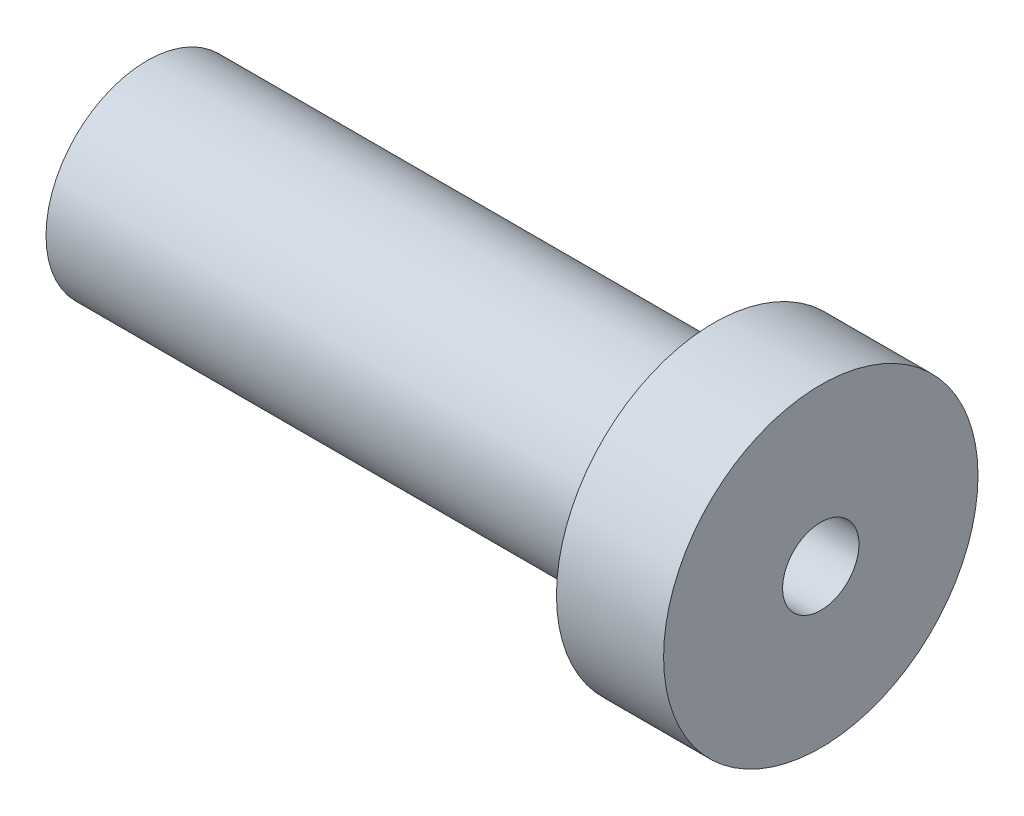
ISO-10303-21;
HEADER;
FILE_DESCRIPTION(('STEP AP214'),'2;1');
FILE_NAME('part.step','',(''),(''),'','','');
FILE_SCHEMA(('AUTOMOTIVE_DESIGN { 1 0 10303 214 1 1 1 1 }'));
ENDSEC;
DATA;
#1=APPLICATION_CONTEXT('core data for automotive mechanical design processes');
#2=APPLICATION_PROTOCOL_DEFINITION('international standard','automotive_design',2000,#1);
#3=PRODUCT_CONTEXT('',#1,'mechanical');
#4=PRODUCT('Part','Part','',(#3));
#5=PRODUCT_RELATED_PRODUCT_CATEGORY('part','',(#4));
#6=PRODUCT_DEFINITION_FORMATION('','',#4);
#7=PRODUCT_DEFINITION_CONTEXT('part definition',#1,'design');
#8=PRODUCT_DEFINITION('design','',#6,#7);
#9=PRODUCT_DEFINITION_SHAPE('','',#8);
#10=(LENGTH_UNIT() NAMED_UNIT(*) SI_UNIT(.MILLI.,.METRE.));
#11=(NAMED_UNIT(*) PLANE_ANGLE_UNIT() SI_UNIT($,.RADIAN.));
#12=(NAMED_UNIT(*) SI_UNIT($,.STERADIAN.) SOLID_ANGLE_UNIT());
#13=UNCERTAINTY_MEASURE_WITH_UNIT(LENGTH_MEASURE(1.E-05),#10,'distance_accuracy_value','');
#14=(GEOMETRIC_REPRESENTATION_CONTEXT(3) GLOBAL_UNCERTAINTY_ASSIGNED_CONTEXT((#13)) GLOBAL_UNIT_ASSIGNED_CONTEXT((#10,
#11,#12)) REPRESENTATION_CONTEXT('',''));
#15=CARTESIAN_POINT('',(0.,0.,0.));
#16=DIRECTION('',(0.,0.,1.));
#17=DIRECTION('',(1.,0.,0.));
#18=AXIS2_PLACEMENT_3D('',#15,#16,#17);
#19=CARTESIAN_POINT('',(0.,0.,0.));
#20=DIRECTION('',(1.,0.,0.));
#21=DIRECTION('',(0.,0.,-1.));
#22=AXIS2_PLACEMENT_3D('',#19,#20,#21);
#23=PLANE('',#22);
#24=CARTESIAN_POINT('',(0.,0.,0.));
#25=DIRECTION('',(1.,0.,0.));
#26=DIRECTION('',(0.,0.,-1.));
#27=AXIS2_PLACEMENT_3D('',#24,#25,#26);
#28=CIRCLE('',#27,1.7);
#29=CARTESIAN_POINT('',(0.,0.,-1.7));
#30=VERTEX_POINT('',#29);
#31=EDGE_CURVE('E61',#30,#30,#28,.T.);
#32=ORIENTED_EDGE('',*,*,#31,.T.);
#33=EDGE_LOOP('',(#32));
#34=FACE_BOUND('',#33,.T.);
#35=CARTESIAN_POINT('',(0.,0.,0.));
#36=DIRECTION('',(-1.,0.,0.));
#37=DIRECTION('',(0.,0.,1.));
#38=AXIS2_PLACEMENT_3D('',#35,#36,#37);
#39=CIRCLE('',#38,4.5);
#40=CARTESIAN_POINT('',(0.,0.,4.5));
#41=VERTEX_POINT('',#40);
#42=EDGE_CURVE('E10',#41,#41,#39,.T.);
#43=ORIENTED_EDGE('',*,*,#42,.T.);
#44=EDGE_LOOP('',(#43));
#45=FACE_BOUND('',#44,.T.);
#46=ADVANCED_FACE('F37',(#34,#45),#23,.F.);
#47=CARTESIAN_POINT('',(-5.95522388059701,0.,0.));
#48=DIRECTION('',(-1.,0.,0.));
#49=DIRECTION('',(0.,0.,1.));
#50=AXIS2_PLACEMENT_3D('',#47,#48,#49);
#51=CYLINDRICAL_SURFACE('',#50,4.5);
#52=ORIENTED_EDGE('',*,*,#42,.F.);
#53=EDGE_LOOP('',(#52));
#54=FACE_BOUND('',#53,.T.);
#55=CARTESIAN_POINT('',(25.2298662996806,0.,0.));
#56=DIRECTION('',(-1.,0.,0.));
#57=DIRECTION('',(0.,0.,1.));
#58=AXIS2_PLACEMENT_3D('',#55,#56,#57);
#59=CIRCLE('',#58,4.5);
#60=CARTESIAN_POINT('',(25.2298662996806,0.,4.5));
#61=VERTEX_POINT('',#60);
#62=EDGE_CURVE('E44',#61,#61,#59,.T.);
#63=ORIENTED_EDGE('',*,*,#62,.T.);
#64=EDGE_LOOP('',(#63));
#65=FACE_BOUND('',#64,.T.);
#66=ADVANCED_FACE('F86',(#54,#65),#51,.T.);
#67=CARTESIAN_POINT('',(25.2298662996806,4.5,0.));
#68=DIRECTION('',(1.,0.,0.));
#69=DIRECTION('',(0.,0.,-1.));
#70=AXIS2_PLACEMENT_3D('',#67,#68,#69);
#71=PLANE('',#70);
#72=ORIENTED_EDGE('',*,*,#62,.F.);
#73=EDGE_LOOP('',(#72));
#74=FACE_BOUND('',#73,.T.);
#75=CARTESIAN_POINT('',(25.2298662996806,0.,0.));
#76=DIRECTION('',(-1.,0.,0.));
#77=DIRECTION('',(0.,0.,1.));
#78=AXIS2_PLACEMENT_3D('',#75,#76,#77);
#79=CIRCLE('',#78,7.);
#80=CARTESIAN_POINT('',(25.2298662996806,0.,7.));
#81=VERTEX_POINT('',#80);
#82=EDGE_CURVE('E49',#81,#81,#79,.T.);
#83=ORIENTED_EDGE('',*,*,#82,.T.);
#84=EDGE_LOOP('',(#83));
#85=FACE_BOUND('',#84,.T.);
#86=ADVANCED_FACE('F80',(#74,#85),#71,.F.);
#87=CARTESIAN_POINT('',(-5.95522388059701,0.,0.));
#88=DIRECTION('',(-1.,0.,0.));
#89=DIRECTION('',(0.,0.,1.));
#90=AXIS2_PLACEMENT_3D('',#87,#88,#89);
#91=CYLINDRICAL_SURFACE('',#90,7.);
#92=ORIENTED_EDGE('',*,*,#82,.F.);
#93=EDGE_LOOP('',(#92));
#94=FACE_BOUND('',#93,.T.);
#95=CARTESIAN_POINT('',(30.,0.,0.));
#96=DIRECTION('',(-1.,0.,0.));
#97=DIRECTION('',(0.,0.,1.));
#98=AXIS2_PLACEMENT_3D('',#95,#96,#97);
#99=CIRCLE('',#98,7.);
#100=CARTESIAN_POINT('',(30.,0.,7.));
#101=VERTEX_POINT('',#100);
#102=EDGE_CURVE('E54',#101,#101,#99,.T.);
#103=ORIENTED_EDGE('',*,*,#102,.T.);
#104=EDGE_LOOP('',(#103));
#105=FACE_BOUND('',#104,.T.);
#106=ADVANCED_FACE('F75',(#94,#105),#91,.T.);
#107=CARTESIAN_POINT('',(30.,7.,0.));
#108=DIRECTION('',(-1.,0.,0.));
#109=DIRECTION('',(0.,0.,1.));
#110=AXIS2_PLACEMENT_3D('',#107,#108,#109);
#111=PLANE('',#110);
#112=CARTESIAN_POINT('',(30.,0.,0.));
#113=DIRECTION('',(1.,0.,0.));
#114=DIRECTION('',(0.,0.,-1.));
#115=AXIS2_PLACEMENT_3D('',#112,#113,#114);
#116=CIRCLE('',#115,1.7);
#117=CARTESIAN_POINT('',(30.,0.,-1.7));
#118=VERTEX_POINT('',#117);
#119=EDGE_CURVE('E60',#118,#118,#116,.T.);
#120=ORIENTED_EDGE('',*,*,#119,.F.);
#121=EDGE_LOOP('',(#120));
#122=FACE_BOUND('',#121,.T.);
#123=ORIENTED_EDGE('',*,*,#102,.F.);
#124=EDGE_LOOP('',(#123));
#125=FACE_BOUND('',#124,.T.);
#126=ADVANCED_FACE('F72',(#122,#125),#111,.F.);
#127=CARTESIAN_POINT('',(30.,0.,0.));
#128=DIRECTION('',(-1.,0.,0.));
#129=DIRECTION('',(0.,0.,1.));
#130=AXIS2_PLACEMENT_3D('',#127,#128,#129);
#131=CYLINDRICAL_SURFACE('',#130,1.7);
#132=ORIENTED_EDGE('',*,*,#119,.T.);
#133=EDGE_LOOP('',(#132));
#134=FACE_BOUND('',#133,.T.);
#135=ORIENTED_EDGE('',*,*,#31,.F.);
#136=EDGE_LOOP('',(#135));
#137=FACE_BOUND('',#136,.T.);
#138=ADVANCED_FACE('F69',(#134,#137),#131,.F.);
#139=CLOSED_SHELL('',(#46,#66,#86,#106,#126,#138));
#140=MANIFOLD_SOLID_BREP('B2',#139);
#141=ADVANCED_BREP_SHAPE_REPRESENTATION('',(#18,#140),#14);
#142=SHAPE_DEFINITION_REPRESENTATION(#9,#141);
ENDSEC;
END-ISO-10303-21;
